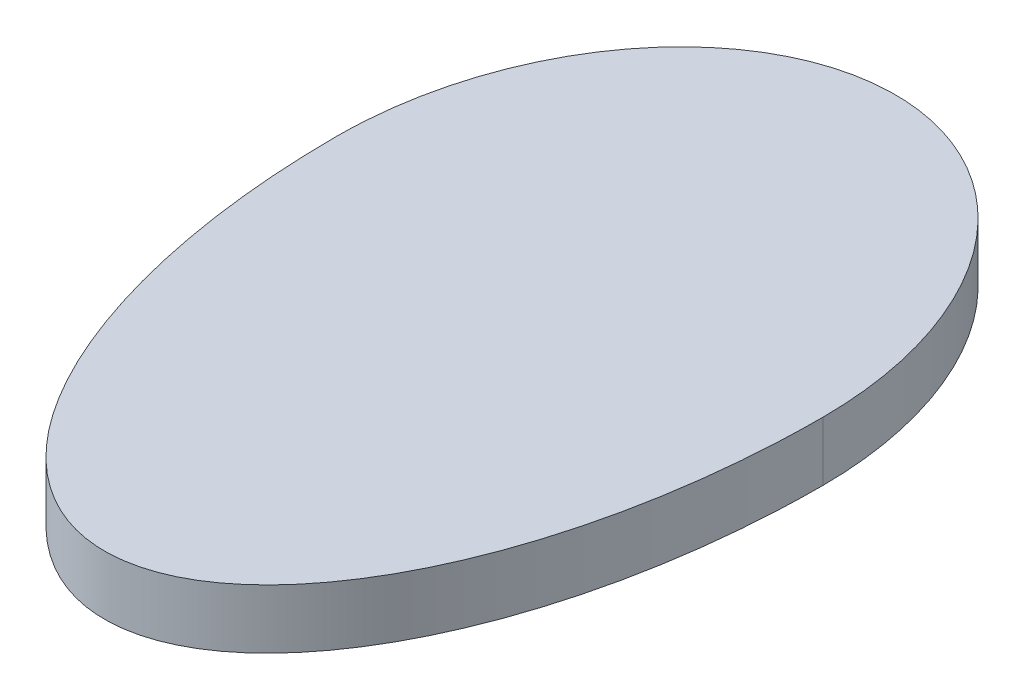
ISO-10303-21;
HEADER;
FILE_DESCRIPTION(('STEP AP214'),'2;1');
FILE_NAME('part.step','',(''),(''),'','','');
FILE_SCHEMA(('AUTOMOTIVE_DESIGN { 1 0 10303 214 1 1 1 1 }'));
ENDSEC;
DATA;
#1=APPLICATION_CONTEXT('core data for automotive mechanical design processes');
#2=APPLICATION_PROTOCOL_DEFINITION('international standard','automotive_design',2000,#1);
#3=PRODUCT_CONTEXT('',#1,'mechanical');
#4=PRODUCT('Part','Part','',(#3));
#5=PRODUCT_RELATED_PRODUCT_CATEGORY('part','',(#4));
#6=PRODUCT_DEFINITION_FORMATION('','',#4);
#7=PRODUCT_DEFINITION_CONTEXT('part definition',#1,'design');
#8=PRODUCT_DEFINITION('design','',#6,#7);
#9=PRODUCT_DEFINITION_SHAPE('','',#8);
#10=(LENGTH_UNIT() NAMED_UNIT(*) SI_UNIT(.MILLI.,.METRE.));
#11=(NAMED_UNIT(*) PLANE_ANGLE_UNIT() SI_UNIT($,.RADIAN.));
#12=(NAMED_UNIT(*) SI_UNIT($,.STERADIAN.) SOLID_ANGLE_UNIT());
#13=UNCERTAINTY_MEASURE_WITH_UNIT(LENGTH_MEASURE(1.E-05),#10,'distance_accuracy_value','');
#14=(GEOMETRIC_REPRESENTATION_CONTEXT(3) GLOBAL_UNCERTAINTY_ASSIGNED_CONTEXT((#13)) GLOBAL_UNIT_ASSIGNED_CONTEXT((#10,
#11,#12)) REPRESENTATION_CONTEXT('',''));
#15=CARTESIAN_POINT('',(0.,0.,0.));
#16=DIRECTION('',(0.,0.,1.));
#17=DIRECTION('',(1.,0.,0.));
#18=AXIS2_PLACEMENT_3D('',#15,#16,#17);
#19=CARTESIAN_POINT('',(0.,20.,0.));
#20=DIRECTION('',(0.,1.,0.));
#21=DIRECTION('',(0.,0.,1.));
#22=AXIS2_PLACEMENT_3D('',#19,#20,#21);
#23=ELLIPSE('',#22,160.73,82.28);
#24=DIRECTION('',(0.,-1.,0.));
#25=VECTOR('',#24,1.);
#26=SURFACE_OF_LINEAR_EXTRUSION('',#23,#25);
#27=CARTESIAN_POINT('',(0.,0.,0.));
#28=DIRECTION('',(0.,1.,0.));
#29=DIRECTION('',(0.,0.,1.));
#30=AXIS2_PLACEMENT_3D('',#27,#28,#29);
#31=ELLIPSE('',#30,160.73,82.28);
#32=CARTESIAN_POINT('',(-82.28,0.,0.));
#33=VERTEX_POINT('',#32);
#34=CARTESIAN_POINT('',(82.28,0.,0.));
#35=VERTEX_POINT('',#34);
#36=EDGE_CURVE('E64',#33,#35,#31,.T.);
#37=ORIENTED_EDGE('',*,*,#36,.T.);
#38=DIRECTION('',(0.,-1.,0.));
#39=VECTOR('',#38,1.);
#40=CARTESIAN_POINT('',(82.28,20.,0.));
#41=LINE('',#40,#39);
#42=CARTESIAN_POINT('',(82.28,20.,0.));
#43=VERTEX_POINT('',#42);
#44=EDGE_CURVE('E11',#43,#35,#41,.T.);
#45=ORIENTED_EDGE('',*,*,#44,.F.);
#46=CARTESIAN_POINT('',(-82.28,20.,0.));
#47=VERTEX_POINT('',#46);
#48=EDGE_CURVE('E63',#47,#43,#23,.T.);
#49=ORIENTED_EDGE('',*,*,#48,.F.);
#50=DIRECTION('',(0.,-1.,0.));
#51=VECTOR('',#50,1.);
#52=CARTESIAN_POINT('',(-82.28,20.,0.));
#53=LINE('',#52,#51);
#54=EDGE_CURVE('E41',#47,#33,#53,.T.);
#55=ORIENTED_EDGE('',*,*,#54,.T.);
#56=EDGE_LOOP('',(#37,#45,#49,#55));
#57=FACE_BOUND('',#56,.T.);
#58=ADVANCED_FACE('F32',(#57),#26,.F.);
#59=CARTESIAN_POINT('',(0.,20.,0.));
#60=DIRECTION('',(0.,1.,0.));
#61=DIRECTION('',(0.,0.,-1.));
#62=AXIS2_PLACEMENT_3D('',#59,#60,#61);
#63=ELLIPSE('',#62,106.76,82.28);
#64=DIRECTION('',(0.,-1.,0.));
#65=VECTOR('',#64,1.);
#66=SURFACE_OF_LINEAR_EXTRUSION('',#63,#65);
#67=CARTESIAN_POINT('',(0.,0.,0.));
#68=DIRECTION('',(0.,1.,0.));
#69=DIRECTION('',(0.,0.,-1.));
#70=AXIS2_PLACEMENT_3D('',#67,#68,#69);
#71=ELLIPSE('',#70,106.76,82.28);
#72=EDGE_CURVE('E56',#35,#33,#71,.T.);
#73=ORIENTED_EDGE('',*,*,#72,.T.);
#74=ORIENTED_EDGE('',*,*,#54,.F.);
#75=EDGE_CURVE('E48',#43,#47,#63,.T.);
#76=ORIENTED_EDGE('',*,*,#75,.F.);
#77=ORIENTED_EDGE('',*,*,#44,.T.);
#78=EDGE_LOOP('',(#73,#74,#76,#77));
#79=FACE_BOUND('',#78,.T.);
#80=ADVANCED_FACE('F59',(#79),#66,.F.);
#81=CARTESIAN_POINT('',(0.,20.,0.));
#82=DIRECTION('',(0.,-1.,0.));
#83=DIRECTION('',(0.,0.,-1.));
#84=AXIS2_PLACEMENT_3D('',#81,#82,#83);
#85=PLANE('',#84);
#86=ORIENTED_EDGE('',*,*,#48,.T.);
#87=ORIENTED_EDGE('',*,*,#75,.T.);
#88=EDGE_LOOP('',(#86,#87));
#89=FACE_BOUND('',#88,.T.);
#90=ADVANCED_FACE('F74',(#89),#85,.F.);
#91=CARTESIAN_POINT('',(0.,0.,0.));
#92=DIRECTION('',(0.,-1.,0.));
#93=DIRECTION('',(0.,0.,-1.));
#94=AXIS2_PLACEMENT_3D('',#91,#92,#93);
#95=PLANE('',#94);
#96=ORIENTED_EDGE('',*,*,#36,.F.);
#97=ORIENTED_EDGE('',*,*,#72,.F.);
#98=EDGE_LOOP('',(#96,#97));
#99=FACE_BOUND('',#98,.T.);
#100=ADVANCED_FACE('F67',(#99),#95,.T.);
#101=CLOSED_SHELL('',(#58,#80,#90,#100));
#102=MANIFOLD_SOLID_BREP('B2',#101);
#103=ADVANCED_BREP_SHAPE_REPRESENTATION('',(#18,#102),#14);
#104=SHAPE_DEFINITION_REPRESENTATION(#9,#103);
ENDSEC;
END-ISO-10303-21;
